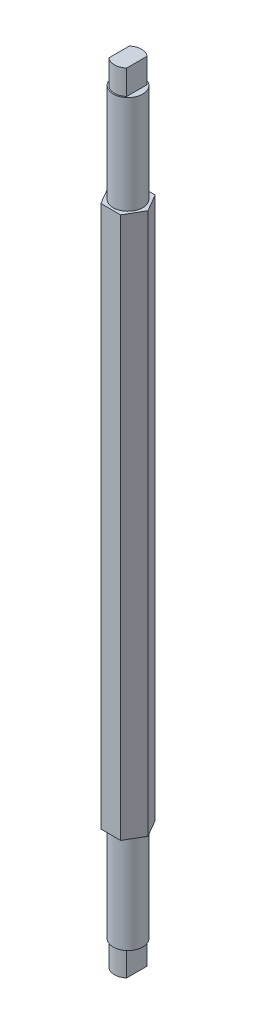
ISO-10303-21;
HEADER;
FILE_DESCRIPTION(('STEP AP214'),'2;1');
FILE_NAME('part.step','',(''),(''),'','','');
FILE_SCHEMA(('AUTOMOTIVE_DESIGN { 1 0 10303 214 1 1 1 1 }'));
ENDSEC;
DATA;
#1=APPLICATION_CONTEXT('core data for automotive mechanical design processes');
#2=APPLICATION_PROTOCOL_DEFINITION('international standard','automotive_design',2000,#1);
#3=PRODUCT_CONTEXT('',#1,'mechanical');
#4=PRODUCT('Part','Part','',(#3));
#5=PRODUCT_RELATED_PRODUCT_CATEGORY('part','',(#4));
#6=PRODUCT_DEFINITION_FORMATION('','',#4);
#7=PRODUCT_DEFINITION_CONTEXT('part definition',#1,'design');
#8=PRODUCT_DEFINITION('design','',#6,#7);
#9=PRODUCT_DEFINITION_SHAPE('','',#8);
#10=(LENGTH_UNIT() NAMED_UNIT(*) SI_UNIT(.MILLI.,.METRE.));
#11=(NAMED_UNIT(*) PLANE_ANGLE_UNIT() SI_UNIT($,.RADIAN.));
#12=(NAMED_UNIT(*) SI_UNIT($,.STERADIAN.) SOLID_ANGLE_UNIT());
#13=UNCERTAINTY_MEASURE_WITH_UNIT(LENGTH_MEASURE(1.E-05),#10,'distance_accuracy_value','');
#14=(GEOMETRIC_REPRESENTATION_CONTEXT(3) GLOBAL_UNCERTAINTY_ASSIGNED_CONTEXT((#13)) GLOBAL_UNIT_ASSIGNED_CONTEXT((#10,
#11,#12)) REPRESENTATION_CONTEXT('',''));
#15=CARTESIAN_POINT('',(0.,0.,0.));
#16=DIRECTION('',(0.,0.,1.));
#17=DIRECTION('',(1.,0.,0.));
#18=AXIS2_PLACEMENT_3D('',#15,#16,#17);
#19=CARTESIAN_POINT('',(0.,-20.,0.));
#20=DIRECTION('',(0.,-1.,0.));
#21=DIRECTION('',(0.,0.,-1.));
#22=AXIS2_PLACEMENT_3D('',#19,#20,#21);
#23=PLANE('',#22);
#24=CARTESIAN_POINT('',(0.,-20.,0.));
#25=DIRECTION('',(0.,-1.,0.));
#26=DIRECTION('',(0.,0.,-1.));
#27=AXIS2_PLACEMENT_3D('',#24,#25,#26);
#28=CIRCLE('',#27,3.);
#29=CARTESIAN_POINT('',(0.,-20.,-3.));
#30=VERTEX_POINT('',#29);
#31=EDGE_CURVE('E158',#30,#30,#28,.T.);
#32=ORIENTED_EDGE('',*,*,#31,.T.);
#33=EDGE_LOOP('',(#32));
#34=FACE_BOUND('',#33,.T.);
#35=CARTESIAN_POINT('',(0.,-20.,0.));
#36=DIRECTION('',(0.,-1.,0.));
#37=DIRECTION('',(0.,0.,-1.));
#38=AXIS2_PLACEMENT_3D('',#35,#36,#37);
#39=CIRCLE('',#38,2.75);
#40=CARTESIAN_POINT('',(1.79891634046723,-20.,2.08));
#41=VERTEX_POINT('',#40);
#42=CARTESIAN_POINT('',(-1.79891634046723,-20.,2.08));
#43=VERTEX_POINT('',#42);
#44=EDGE_CURVE('E179',#41,#43,#39,.T.);
#45=ORIENTED_EDGE('',*,*,#44,.F.);
#46=DIRECTION('',(0.,0.,-1.));
#47=VECTOR('',#46,1.);
#48=CARTESIAN_POINT('',(1.79891634046723,-20.,0.));
#49=LINE('',#48,#47);
#50=CARTESIAN_POINT('',(1.79891634046723,-20.,-2.08));
#51=VERTEX_POINT('',#50);
#52=EDGE_CURVE('E65',#41,#51,#49,.T.);
#53=ORIENTED_EDGE('',*,*,#52,.T.);
#54=CARTESIAN_POINT('',(-1.79891634046723,-20.,-2.08));
#55=VERTEX_POINT('',#54);
#56=EDGE_CURVE('E70',#55,#51,#39,.T.);
#57=ORIENTED_EDGE('',*,*,#56,.F.);
#58=DIRECTION('',(0.,0.,-1.));
#59=VECTOR('',#58,1.);
#60=CARTESIAN_POINT('',(-1.79891634046723,-20.,0.));
#61=LINE('',#60,#59);
#62=EDGE_CURVE('E177',#43,#55,#61,.T.);
#63=ORIENTED_EDGE('',*,*,#62,.F.);
#64=EDGE_LOOP('',(#45,#53,#57,#63));
#65=FACE_BOUND('',#64,.T.);
#66=ADVANCED_FACE('F47',(#34,#65),#23,.T.);
#67=CARTESIAN_POINT('',(0.,130.,0.));
#68=DIRECTION('',(0.,1.,0.));
#69=DIRECTION('',(0.,0.,1.));
#70=AXIS2_PLACEMENT_3D('',#67,#68,#69);
#71=PLANE('',#70);
#72=CARTESIAN_POINT('',(0.,130.,0.));
#73=DIRECTION('',(0.,1.,0.));
#74=DIRECTION('',(0.,0.,1.));
#75=AXIS2_PLACEMENT_3D('',#72,#73,#74);
#76=CIRCLE('',#75,3.);
#77=CARTESIAN_POINT('',(0.,130.,3.));
#78=VERTEX_POINT('',#77);
#79=EDGE_CURVE('E239',#78,#78,#76,.T.);
#80=ORIENTED_EDGE('',*,*,#79,.T.);
#81=EDGE_LOOP('',(#80));
#82=FACE_BOUND('',#81,.T.);
#83=CARTESIAN_POINT('',(0.,130.,0.));
#84=DIRECTION('',(0.,1.,0.));
#85=DIRECTION('',(0.,0.,1.));
#86=AXIS2_PLACEMENT_3D('',#83,#84,#85);
#87=CIRCLE('',#86,2.75);
#88=CARTESIAN_POINT('',(1.79891634046723,130.,-2.08));
#89=VERTEX_POINT('',#88);
#90=CARTESIAN_POINT('',(-1.79891634046723,130.,-2.08));
#91=VERTEX_POINT('',#90);
#92=EDGE_CURVE('E215',#89,#91,#87,.T.);
#93=ORIENTED_EDGE('',*,*,#92,.F.);
#94=DIRECTION('',(0.,0.,1.));
#95=VECTOR('',#94,1.);
#96=CARTESIAN_POINT('',(1.79891634046723,130.,0.));
#97=LINE('',#96,#95);
#98=CARTESIAN_POINT('',(1.79891634046723,130.,2.08));
#99=VERTEX_POINT('',#98);
#100=EDGE_CURVE('E199',#89,#99,#97,.T.);
#101=ORIENTED_EDGE('',*,*,#100,.T.);
#102=CARTESIAN_POINT('',(-1.79891634046723,130.,2.08));
#103=VERTEX_POINT('',#102);
#104=EDGE_CURVE('E206',#103,#99,#87,.T.);
#105=ORIENTED_EDGE('',*,*,#104,.F.);
#106=DIRECTION('',(0.,0.,1.));
#107=VECTOR('',#106,1.);
#108=CARTESIAN_POINT('',(-1.79891634046723,130.,0.));
#109=LINE('',#108,#107);
#110=EDGE_CURVE('E219',#91,#103,#109,.T.);
#111=ORIENTED_EDGE('',*,*,#110,.F.);
#112=EDGE_LOOP('',(#93,#101,#105,#111));
#113=FACE_BOUND('',#112,.T.);
#114=ADVANCED_FACE('F344',(#82,#113),#71,.T.);
#115=CARTESIAN_POINT('',(2.02072594216373,110.,3.49999999999998));
#116=DIRECTION('',(-0.866025403784441,0.,-0.499999999999995));
#117=DIRECTION('',(-0.499999999999995,0.,0.866025403784441));
#118=AXIS2_PLACEMENT_3D('',#115,#116,#117);
#119=PLANE('',#118);
#120=DIRECTION('',(0.499999999999995,0.,-0.866025403784441));
#121=VECTOR('',#120,1.);
#122=CARTESIAN_POINT('',(2.02072594216373,0.,3.49999999999998));
#123=LINE('',#122,#121);
#124=CARTESIAN_POINT('',(2.02072594216373,0.,3.49999999999998));
#125=VERTEX_POINT('',#124);
#126=CARTESIAN_POINT('',(4.04145188432738,0.,0.));
#127=VERTEX_POINT('',#126);
#128=EDGE_CURVE('E243',#125,#127,#123,.T.);
#129=ORIENTED_EDGE('',*,*,#128,.T.);
#130=DIRECTION('',(0.,-1.,0.));
#131=VECTOR('',#130,1.);
#132=CARTESIAN_POINT('',(4.04145188432738,110.,0.));
#133=LINE('',#132,#131);
#134=CARTESIAN_POINT('',(4.04145188432738,110.,0.));
#135=VERTEX_POINT('',#134);
#136=EDGE_CURVE('E51',#135,#127,#133,.T.);
#137=ORIENTED_EDGE('',*,*,#136,.F.);
#138=DIRECTION('',(0.499999999999995,0.,-0.866025403784441));
#139=VECTOR('',#138,1.);
#140=CARTESIAN_POINT('',(2.02072594216373,110.,3.49999999999998));
#141=LINE('',#140,#139);
#142=CARTESIAN_POINT('',(2.02072594216373,110.,3.49999999999998));
#143=VERTEX_POINT('',#142);
#144=EDGE_CURVE('E247',#143,#135,#141,.T.);
#145=ORIENTED_EDGE('',*,*,#144,.F.);
#146=DIRECTION('',(0.,-1.,0.));
#147=VECTOR('',#146,1.);
#148=CARTESIAN_POINT('',(2.02072594216373,110.,3.49999999999998));
#149=LINE('',#148,#147);
#150=EDGE_CURVE('E267',#143,#125,#149,.T.);
#151=ORIENTED_EDGE('',*,*,#150,.T.);
#152=EDGE_LOOP('',(#129,#137,#145,#151));
#153=FACE_BOUND('',#152,.T.);
#154=ADVANCED_FACE('F49',(#153),#119,.F.);
#155=CARTESIAN_POINT('',(4.04145188432738,110.,0.));
#156=DIRECTION('',(-0.866025403784438,0.,0.500000000000001));
#157=DIRECTION('',(0.500000000000001,0.,0.866025403784438));
#158=AXIS2_PLACEMENT_3D('',#155,#156,#157);
#159=PLANE('',#158);
#160=DIRECTION('',(-0.500000000000001,0.,-0.866025403784438));
#161=VECTOR('',#160,1.);
#162=CARTESIAN_POINT('',(4.04145188432738,0.,0.));
#163=LINE('',#162,#161);
#164=CARTESIAN_POINT('',(2.02072594216368,0.,-3.50000000000001));
#165=VERTEX_POINT('',#164);
#166=EDGE_CURVE('E271',#127,#165,#163,.T.);
#167=ORIENTED_EDGE('',*,*,#166,.T.);
#168=DIRECTION('',(0.,-1.,0.));
#169=VECTOR('',#168,1.);
#170=CARTESIAN_POINT('',(2.02072594216368,110.,-3.50000000000001));
#171=LINE('',#170,#169);
#172=CARTESIAN_POINT('',(2.02072594216368,110.,-3.50000000000001));
#173=VERTEX_POINT('',#172);
#174=EDGE_CURVE('E299',#173,#165,#171,.T.);
#175=ORIENTED_EDGE('',*,*,#174,.F.);
#176=DIRECTION('',(-0.500000000000001,0.,-0.866025403784438));
#177=VECTOR('',#176,1.);
#178=CARTESIAN_POINT('',(4.04145188432738,110.,0.));
#179=LINE('',#178,#177);
#180=EDGE_CURVE('E251',#135,#173,#179,.T.);
#181=ORIENTED_EDGE('',*,*,#180,.F.);
#182=ORIENTED_EDGE('',*,*,#136,.T.);
#183=EDGE_LOOP('',(#167,#175,#181,#182));
#184=FACE_BOUND('',#183,.T.);
#185=ADVANCED_FACE('F310',(#184),#159,.F.);
#186=CARTESIAN_POINT('',(2.02072594216368,110.,-3.50000000000001));
#187=DIRECTION('',(0.,0.,1.));
#188=DIRECTION('',(1.,0.,0.));
#189=AXIS2_PLACEMENT_3D('',#186,#187,#188);
#190=PLANE('',#189);
#191=DIRECTION('',(-1.,0.,0.));
#192=VECTOR('',#191,1.);
#193=CARTESIAN_POINT('',(2.02072594216368,0.,-3.50000000000001));
#194=LINE('',#193,#192);
#195=CARTESIAN_POINT('',(-2.02072594216371,0.,-3.49999999999999));
#196=VERTEX_POINT('',#195);
#197=EDGE_CURVE('E274',#165,#196,#194,.T.);
#198=ORIENTED_EDGE('',*,*,#197,.T.);
#199=DIRECTION('',(0.,-1.,0.));
#200=VECTOR('',#199,1.);
#201=CARTESIAN_POINT('',(-2.02072594216371,110.,-3.49999999999999));
#202=LINE('',#201,#200);
#203=CARTESIAN_POINT('',(-2.02072594216371,110.,-3.49999999999999));
#204=VERTEX_POINT('',#203);
#205=EDGE_CURVE('E296',#204,#196,#202,.T.);
#206=ORIENTED_EDGE('',*,*,#205,.F.);
#207=DIRECTION('',(-1.,0.,0.));
#208=VECTOR('',#207,1.);
#209=CARTESIAN_POINT('',(2.02072594216368,110.,-3.50000000000001));
#210=LINE('',#209,#208);
#211=EDGE_CURVE('E255',#173,#204,#210,.T.);
#212=ORIENTED_EDGE('',*,*,#211,.F.);
#213=ORIENTED_EDGE('',*,*,#174,.T.);
#214=EDGE_LOOP('',(#198,#206,#212,#213));
#215=FACE_BOUND('',#214,.T.);
#216=ADVANCED_FACE('F321',(#215),#190,.F.);
#217=CARTESIAN_POINT('',(-2.02072594216371,110.,-3.49999999999999));
#218=DIRECTION('',(0.866025403784442,0.,0.499999999999995));
#219=DIRECTION('',(0.499999999999995,0.,-0.866025403784442));
#220=AXIS2_PLACEMENT_3D('',#217,#218,#219);
#221=PLANE('',#220);
#222=DIRECTION('',(-0.499999999999995,0.,0.866025403784442));
#223=VECTOR('',#222,1.);
#224=CARTESIAN_POINT('',(-2.02072594216371,0.,-3.49999999999999));
#225=LINE('',#224,#223);
#226=CARTESIAN_POINT('',(-4.04145188432738,0.,0.));
#227=VERTEX_POINT('',#226);
#228=EDGE_CURVE('E277',#196,#227,#225,.T.);
#229=ORIENTED_EDGE('',*,*,#228,.T.);
#230=DIRECTION('',(0.,-1.,0.));
#231=VECTOR('',#230,1.);
#232=CARTESIAN_POINT('',(-4.04145188432738,110.,0.));
#233=LINE('',#232,#231);
#234=CARTESIAN_POINT('',(-4.04145188432738,110.,0.));
#235=VERTEX_POINT('',#234);
#236=EDGE_CURVE('E292',#235,#227,#233,.T.);
#237=ORIENTED_EDGE('',*,*,#236,.F.);
#238=DIRECTION('',(-0.499999999999995,0.,0.866025403784442));
#239=VECTOR('',#238,1.);
#240=CARTESIAN_POINT('',(-2.02072594216371,110.,-3.49999999999999));
#241=LINE('',#240,#239);
#242=EDGE_CURVE('E258',#204,#235,#241,.T.);
#243=ORIENTED_EDGE('',*,*,#242,.F.);
#244=ORIENTED_EDGE('',*,*,#205,.T.);
#245=EDGE_LOOP('',(#229,#237,#243,#244));
#246=FACE_BOUND('',#245,.T.);
#247=ADVANCED_FACE('F324',(#246),#221,.F.);
#248=CARTESIAN_POINT('',(-4.04145188432738,110.,0.));
#249=DIRECTION('',(0.866025403784435,0.,-0.500000000000007));
#250=DIRECTION('',(-0.500000000000007,0.,-0.866025403784434));
#251=AXIS2_PLACEMENT_3D('',#248,#249,#250);
#252=PLANE('',#251);
#253=DIRECTION('',(0.500000000000007,0.,0.866025403784435));
#254=VECTOR('',#253,1.);
#255=CARTESIAN_POINT('',(-4.04145188432738,0.,0.));
#256=LINE('',#255,#254);
#257=CARTESIAN_POINT('',(-2.02072594216366,0.,3.50000000000002));
#258=VERTEX_POINT('',#257);
#259=EDGE_CURVE('E280',#227,#258,#256,.T.);
#260=ORIENTED_EDGE('',*,*,#259,.T.);
#261=DIRECTION('',(0.,-1.,0.));
#262=VECTOR('',#261,1.);
#263=CARTESIAN_POINT('',(-2.02072594216366,110.,3.50000000000002));
#264=LINE('',#263,#262);
#265=CARTESIAN_POINT('',(-2.02072594216366,110.,3.50000000000002));
#266=VERTEX_POINT('',#265);
#267=EDGE_CURVE('E288',#266,#258,#264,.T.);
#268=ORIENTED_EDGE('',*,*,#267,.F.);
#269=DIRECTION('',(0.500000000000007,0.,0.866025403784435));
#270=VECTOR('',#269,1.);
#271=CARTESIAN_POINT('',(-4.04145188432738,110.,0.));
#272=LINE('',#271,#270);
#273=EDGE_CURVE('E261',#235,#266,#272,.T.);
#274=ORIENTED_EDGE('',*,*,#273,.F.);
#275=ORIENTED_EDGE('',*,*,#236,.T.);
#276=EDGE_LOOP('',(#260,#268,#274,#275));
#277=FACE_BOUND('',#276,.T.);
#278=ADVANCED_FACE('F334',(#277),#252,.F.);
#279=CARTESIAN_POINT('',(-2.02072594216366,110.,3.50000000000002));
#280=DIRECTION('',(0.,0.,-1.));
#281=DIRECTION('',(-1.,0.,0.));
#282=AXIS2_PLACEMENT_3D('',#279,#280,#281);
#283=PLANE('',#282);
#284=DIRECTION('',(1.,0.,0.));
#285=VECTOR('',#284,1.);
#286=CARTESIAN_POINT('',(-2.02072594216366,0.,3.50000000000002));
#287=LINE('',#286,#285);
#288=EDGE_CURVE('E252',#258,#125,#287,.T.);
#289=ORIENTED_EDGE('',*,*,#288,.T.);
#290=ORIENTED_EDGE('',*,*,#150,.F.);
#291=DIRECTION('',(1.,0.,0.));
#292=VECTOR('',#291,1.);
#293=CARTESIAN_POINT('',(-2.02072594216366,110.,3.50000000000002));
#294=LINE('',#293,#292);
#295=EDGE_CURVE('E264',#266,#143,#294,.T.);
#296=ORIENTED_EDGE('',*,*,#295,.F.);
#297=ORIENTED_EDGE('',*,*,#267,.T.);
#298=EDGE_LOOP('',(#289,#290,#296,#297));
#299=FACE_BOUND('',#298,.T.);
#300=ADVANCED_FACE('F332',(#299),#283,.F.);
#301=CARTESIAN_POINT('',(0.,110.,0.));
#302=DIRECTION('',(0.,1.,0.));
#303=DIRECTION('',(0.,0.,1.));
#304=AXIS2_PLACEMENT_3D('',#301,#302,#303);
#305=PLANE('',#304);
#306=CARTESIAN_POINT('',(0.,110.,0.));
#307=DIRECTION('',(0.,1.,0.));
#308=DIRECTION('',(0.,0.,1.));
#309=AXIS2_PLACEMENT_3D('',#306,#307,#308);
#310=CIRCLE('',#309,3.);
#311=CARTESIAN_POINT('',(0.,110.,3.));
#312=VERTEX_POINT('',#311);
#313=EDGE_CURVE('E57',#312,#312,#310,.T.);
#314=ORIENTED_EDGE('',*,*,#313,.F.);
#315=EDGE_LOOP('',(#314));
#316=FACE_BOUND('',#315,.T.);
#317=ORIENTED_EDGE('',*,*,#144,.T.);
#318=ORIENTED_EDGE('',*,*,#180,.T.);
#319=ORIENTED_EDGE('',*,*,#211,.T.);
#320=ORIENTED_EDGE('',*,*,#242,.T.);
#321=ORIENTED_EDGE('',*,*,#273,.T.);
#322=ORIENTED_EDGE('',*,*,#295,.T.);
#323=EDGE_LOOP('',(#317,#318,#319,#320,#321,#322));
#324=FACE_BOUND('',#323,.T.);
#325=ADVANCED_FACE('F328',(#316,#324),#305,.T.);
#326=CARTESIAN_POINT('',(0.,0.,0.));
#327=DIRECTION('',(0.,1.,0.));
#328=DIRECTION('',(0.,0.,1.));
#329=AXIS2_PLACEMENT_3D('',#326,#327,#328);
#330=PLANE('',#329);
#331=CARTESIAN_POINT('',(0.,0.,0.));
#332=DIRECTION('',(0.,-1.,0.));
#333=DIRECTION('',(0.,0.,-1.));
#334=AXIS2_PLACEMENT_3D('',#331,#332,#333);
#335=CIRCLE('',#334,3.);
#336=CARTESIAN_POINT('',(0.,0.,-3.));
#337=VERTEX_POINT('',#336);
#338=EDGE_CURVE('E11',#337,#337,#335,.T.);
#339=ORIENTED_EDGE('',*,*,#338,.F.);
#340=EDGE_LOOP('',(#339));
#341=FACE_BOUND('',#340,.T.);
#342=ORIENTED_EDGE('',*,*,#128,.F.);
#343=ORIENTED_EDGE('',*,*,#288,.F.);
#344=ORIENTED_EDGE('',*,*,#259,.F.);
#345=ORIENTED_EDGE('',*,*,#228,.F.);
#346=ORIENTED_EDGE('',*,*,#197,.F.);
#347=ORIENTED_EDGE('',*,*,#166,.F.);
#348=EDGE_LOOP('',(#342,#343,#344,#345,#346,#347));
#349=FACE_BOUND('',#348,.T.);
#350=ADVANCED_FACE('F317',(#341,#349),#330,.F.);
#351=CARTESIAN_POINT('',(0.,130.,0.));
#352=DIRECTION('',(0.,-1.,0.));
#353=DIRECTION('',(0.,0.,-1.));
#354=AXIS2_PLACEMENT_3D('',#351,#352,#353);
#355=CYLINDRICAL_SURFACE('',#354,3.);
#356=ORIENTED_EDGE('',*,*,#79,.F.);
#357=EDGE_LOOP('',(#356));
#358=FACE_BOUND('',#357,.T.);
#359=ORIENTED_EDGE('',*,*,#313,.T.);
#360=EDGE_LOOP('',(#359));
#361=FACE_BOUND('',#360,.T.);
#362=ADVANCED_FACE('F375',(#358,#361),#355,.T.);
#363=CARTESIAN_POINT('',(1.79891634046723,135.,0.));
#364=DIRECTION('',(1.,0.,0.));
#365=DIRECTION('',(0.,0.,-1.));
#366=AXIS2_PLACEMENT_3D('',#363,#364,#365);
#367=PLANE('',#366);
#368=ORIENTED_EDGE('',*,*,#100,.F.);
#369=DIRECTION('',(0.,-1.,0.));
#370=VECTOR('',#369,1.);
#371=CARTESIAN_POINT('',(1.79891634046723,135.,-2.08));
#372=LINE('',#371,#370);
#373=CARTESIAN_POINT('',(1.79891634046723,135.,-2.08));
#374=VERTEX_POINT('',#373);
#375=EDGE_CURVE('E235',#374,#89,#372,.T.);
#376=ORIENTED_EDGE('',*,*,#375,.F.);
#377=DIRECTION('',(0.,0.,1.));
#378=VECTOR('',#377,1.);
#379=CARTESIAN_POINT('',(1.79891634046723,135.,0.));
#380=LINE('',#379,#378);
#381=CARTESIAN_POINT('',(1.79891634046723,135.,2.08));
#382=VERTEX_POINT('',#381);
#383=EDGE_CURVE('E201',#374,#382,#380,.T.);
#384=ORIENTED_EDGE('',*,*,#383,.T.);
#385=DIRECTION('',(0.,-1.,0.));
#386=VECTOR('',#385,1.);
#387=CARTESIAN_POINT('',(1.79891634046723,135.,2.08));
#388=LINE('',#387,#386);
#389=EDGE_CURVE('E223',#382,#99,#388,.T.);
#390=ORIENTED_EDGE('',*,*,#389,.T.);
#391=EDGE_LOOP('',(#368,#376,#384,#390));
#392=FACE_BOUND('',#391,.T.);
#393=ADVANCED_FACE('F373',(#392),#367,.T.);
#394=CARTESIAN_POINT('',(0.,135.,0.));
#395=DIRECTION('',(0.,-1.,0.));
#396=DIRECTION('',(0.,0.,-1.));
#397=AXIS2_PLACEMENT_3D('',#394,#395,#396);
#398=CYLINDRICAL_SURFACE('',#397,2.75);
#399=ORIENTED_EDGE('',*,*,#92,.T.);
#400=DIRECTION('',(0.,-1.,0.));
#401=VECTOR('',#400,1.);
#402=CARTESIAN_POINT('',(-1.79891634046723,135.,-2.08));
#403=LINE('',#402,#401);
#404=CARTESIAN_POINT('',(-1.79891634046723,135.,-2.08));
#405=VERTEX_POINT('',#404);
#406=EDGE_CURVE('E231',#405,#91,#403,.T.);
#407=ORIENTED_EDGE('',*,*,#406,.F.);
#408=CARTESIAN_POINT('',(0.,135.,0.));
#409=DIRECTION('',(0.,1.,0.));
#410=DIRECTION('',(0.,0.,1.));
#411=AXIS2_PLACEMENT_3D('',#408,#409,#410);
#412=CIRCLE('',#411,2.75);
#413=EDGE_CURVE('E205',#374,#405,#412,.T.);
#414=ORIENTED_EDGE('',*,*,#413,.F.);
#415=ORIENTED_EDGE('',*,*,#375,.T.);
#416=EDGE_LOOP('',(#399,#407,#414,#415));
#417=FACE_BOUND('',#416,.T.);
#418=ADVANCED_FACE('F369',(#417),#398,.T.);
#419=CARTESIAN_POINT('',(-1.79891634046723,135.,0.));
#420=DIRECTION('',(1.,0.,0.));
#421=DIRECTION('',(0.,0.,-1.));
#422=AXIS2_PLACEMENT_3D('',#419,#420,#421);
#423=PLANE('',#422);
#424=ORIENTED_EDGE('',*,*,#110,.T.);
#425=DIRECTION('',(0.,-1.,0.));
#426=VECTOR('',#425,1.);
#427=CARTESIAN_POINT('',(-1.79891634046723,135.,2.08));
#428=LINE('',#427,#426);
#429=CARTESIAN_POINT('',(-1.79891634046723,135.,2.08));
#430=VERTEX_POINT('',#429);
#431=EDGE_CURVE('E227',#430,#103,#428,.T.);
#432=ORIENTED_EDGE('',*,*,#431,.F.);
#433=DIRECTION('',(0.,0.,1.));
#434=VECTOR('',#433,1.);
#435=CARTESIAN_POINT('',(-1.79891634046723,135.,0.));
#436=LINE('',#435,#434);
#437=EDGE_CURVE('E209',#405,#430,#436,.T.);
#438=ORIENTED_EDGE('',*,*,#437,.F.);
#439=ORIENTED_EDGE('',*,*,#406,.T.);
#440=EDGE_LOOP('',(#424,#432,#438,#439));
#441=FACE_BOUND('',#440,.T.);
#442=ADVANCED_FACE('F367',(#441),#423,.F.);
#443=ORIENTED_EDGE('',*,*,#104,.T.);
#444=ORIENTED_EDGE('',*,*,#389,.F.);
#445=EDGE_CURVE('E210',#430,#382,#412,.T.);
#446=ORIENTED_EDGE('',*,*,#445,.F.);
#447=ORIENTED_EDGE('',*,*,#431,.T.);
#448=EDGE_LOOP('',(#443,#444,#446,#447));
#449=FACE_BOUND('',#448,.T.);
#450=ADVANCED_FACE('F363',(#449),#398,.T.);
#451=CARTESIAN_POINT('',(0.,135.,0.));
#452=DIRECTION('',(0.,1.,0.));
#453=DIRECTION('',(0.,0.,1.));
#454=AXIS2_PLACEMENT_3D('',#451,#452,#453);
#455=PLANE('',#454);
#456=ORIENTED_EDGE('',*,*,#383,.F.);
#457=ORIENTED_EDGE('',*,*,#413,.T.);
#458=ORIENTED_EDGE('',*,*,#437,.T.);
#459=ORIENTED_EDGE('',*,*,#445,.T.);
#460=EDGE_LOOP('',(#456,#457,#458,#459));
#461=FACE_BOUND('',#460,.T.);
#462=ADVANCED_FACE('F359',(#461),#455,.T.);
#463=CARTESIAN_POINT('',(0.,-20.,0.));
#464=DIRECTION('',(0.,1.,0.));
#465=DIRECTION('',(0.,0.,1.));
#466=AXIS2_PLACEMENT_3D('',#463,#464,#465);
#467=CYLINDRICAL_SURFACE('',#466,3.);
#468=ORIENTED_EDGE('',*,*,#31,.F.);
#469=EDGE_LOOP('',(#468));
#470=FACE_BOUND('',#469,.T.);
#471=ORIENTED_EDGE('',*,*,#338,.T.);
#472=EDGE_LOOP('',(#471));
#473=FACE_BOUND('',#472,.T.);
#474=ADVANCED_FACE('F357',(#470,#473),#467,.T.);
#475=CARTESIAN_POINT('',(1.79891634046723,-25.,0.));
#476=DIRECTION('',(1.,0.,0.));
#477=DIRECTION('',(0.,0.,-1.));
#478=AXIS2_PLACEMENT_3D('',#475,#476,#477);
#479=PLANE('',#478);
#480=ORIENTED_EDGE('',*,*,#52,.F.);
#481=DIRECTION('',(0.,1.,0.));
#482=VECTOR('',#481,1.);
#483=CARTESIAN_POINT('',(1.79891634046723,-25.,2.08));
#484=LINE('',#483,#482);
#485=CARTESIAN_POINT('',(1.79891634046723,-25.,2.08));
#486=VERTEX_POINT('',#485);
#487=EDGE_CURVE('E150',#486,#41,#484,.T.);
#488=ORIENTED_EDGE('',*,*,#487,.F.);
#489=DIRECTION('',(0.,0.,-1.));
#490=VECTOR('',#489,1.);
#491=CARTESIAN_POINT('',(1.79891634046723,-25.,0.));
#492=LINE('',#491,#490);
#493=CARTESIAN_POINT('',(1.79891634046723,-25.,-2.08));
#494=VERTEX_POINT('',#493);
#495=EDGE_CURVE('E154',#486,#494,#492,.T.);
#496=ORIENTED_EDGE('',*,*,#495,.T.);
#497=DIRECTION('',(0.,1.,0.));
#498=VECTOR('',#497,1.);
#499=CARTESIAN_POINT('',(1.79891634046723,-25.,-2.08));
#500=LINE('',#499,#498);
#501=EDGE_CURVE('E188',#494,#51,#500,.T.);
#502=ORIENTED_EDGE('',*,*,#501,.T.);
#503=EDGE_LOOP('',(#480,#488,#496,#502));
#504=FACE_BOUND('',#503,.T.);
#505=ADVANCED_FACE('F152',(#504),#479,.T.);
#506=CARTESIAN_POINT('',(0.,-25.,0.));
#507=DIRECTION('',(0.,1.,0.));
#508=DIRECTION('',(0.,0.,1.));
#509=AXIS2_PLACEMENT_3D('',#506,#507,#508);
#510=CYLINDRICAL_SURFACE('',#509,2.75);
#511=ORIENTED_EDGE('',*,*,#44,.T.);
#512=DIRECTION('',(0.,1.,0.));
#513=VECTOR('',#512,1.);
#514=CARTESIAN_POINT('',(-1.79891634046723,-25.,2.08));
#515=LINE('',#514,#513);
#516=CARTESIAN_POINT('',(-1.79891634046723,-25.,2.08));
#517=VERTEX_POINT('',#516);
#518=EDGE_CURVE('E159',#517,#43,#515,.T.);
#519=ORIENTED_EDGE('',*,*,#518,.F.);
#520=CARTESIAN_POINT('',(0.,-25.,0.));
#521=DIRECTION('',(0.,-1.,0.));
#522=DIRECTION('',(0.,0.,-1.));
#523=AXIS2_PLACEMENT_3D('',#520,#521,#522);
#524=CIRCLE('',#523,2.75);
#525=EDGE_CURVE('E162',#486,#517,#524,.T.);
#526=ORIENTED_EDGE('',*,*,#525,.F.);
#527=ORIENTED_EDGE('',*,*,#487,.T.);
#528=EDGE_LOOP('',(#511,#519,#526,#527));
#529=FACE_BOUND('',#528,.T.);
#530=ADVANCED_FACE('F163',(#529),#510,.T.);
#531=CARTESIAN_POINT('',(-1.79891634046723,-25.,0.));
#532=DIRECTION('',(1.,0.,0.));
#533=DIRECTION('',(0.,0.,-1.));
#534=AXIS2_PLACEMENT_3D('',#531,#532,#533);
#535=PLANE('',#534);
#536=ORIENTED_EDGE('',*,*,#62,.T.);
#537=DIRECTION('',(0.,1.,0.));
#538=VECTOR('',#537,1.);
#539=CARTESIAN_POINT('',(-1.79891634046723,-25.,-2.08));
#540=LINE('',#539,#538);
#541=CARTESIAN_POINT('',(-1.79891634046723,-25.,-2.08));
#542=VERTEX_POINT('',#541);
#543=EDGE_CURVE('E191',#542,#55,#540,.T.);
#544=ORIENTED_EDGE('',*,*,#543,.F.);
#545=DIRECTION('',(0.,0.,-1.));
#546=VECTOR('',#545,1.);
#547=CARTESIAN_POINT('',(-1.79891634046723,-25.,0.));
#548=LINE('',#547,#546);
#549=EDGE_CURVE('E168',#517,#542,#548,.T.);
#550=ORIENTED_EDGE('',*,*,#549,.F.);
#551=ORIENTED_EDGE('',*,*,#518,.T.);
#552=EDGE_LOOP('',(#536,#544,#550,#551));
#553=FACE_BOUND('',#552,.T.);
#554=ADVANCED_FACE('F423',(#553),#535,.F.);
#555=ORIENTED_EDGE('',*,*,#56,.T.);
#556=ORIENTED_EDGE('',*,*,#501,.F.);
#557=EDGE_CURVE('E170',#542,#494,#524,.T.);
#558=ORIENTED_EDGE('',*,*,#557,.F.);
#559=ORIENTED_EDGE('',*,*,#543,.T.);
#560=EDGE_LOOP('',(#555,#556,#558,#559));
#561=FACE_BOUND('',#560,.T.);
#562=ADVANCED_FACE('F425',(#561),#510,.T.);
#563=CARTESIAN_POINT('',(0.,-25.,0.));
#564=DIRECTION('',(0.,-1.,0.));
#565=DIRECTION('',(0.,0.,-1.));
#566=AXIS2_PLACEMENT_3D('',#563,#564,#565);
#567=PLANE('',#566);
#568=ORIENTED_EDGE('',*,*,#495,.F.);
#569=ORIENTED_EDGE('',*,*,#525,.T.);
#570=ORIENTED_EDGE('',*,*,#549,.T.);
#571=ORIENTED_EDGE('',*,*,#557,.T.);
#572=EDGE_LOOP('',(#568,#569,#570,#571));
#573=FACE_BOUND('',#572,.T.);
#574=ADVANCED_FACE('F171',(#573),#567,.T.);
#575=CLOSED_SHELL('',(#66,#114,#154,#185,#216,#247,#278,#300,#325,#350,#362,#393,#418,#442,#450,
#462,#474,#505,#530,#554,#562,#574));
#576=MANIFOLD_SOLID_BREP('B2',#575);
#577=ADVANCED_BREP_SHAPE_REPRESENTATION('',(#18,#576),#14);
#578=SHAPE_DEFINITION_REPRESENTATION(#9,#577);
ENDSEC;
END-ISO-10303-21;
